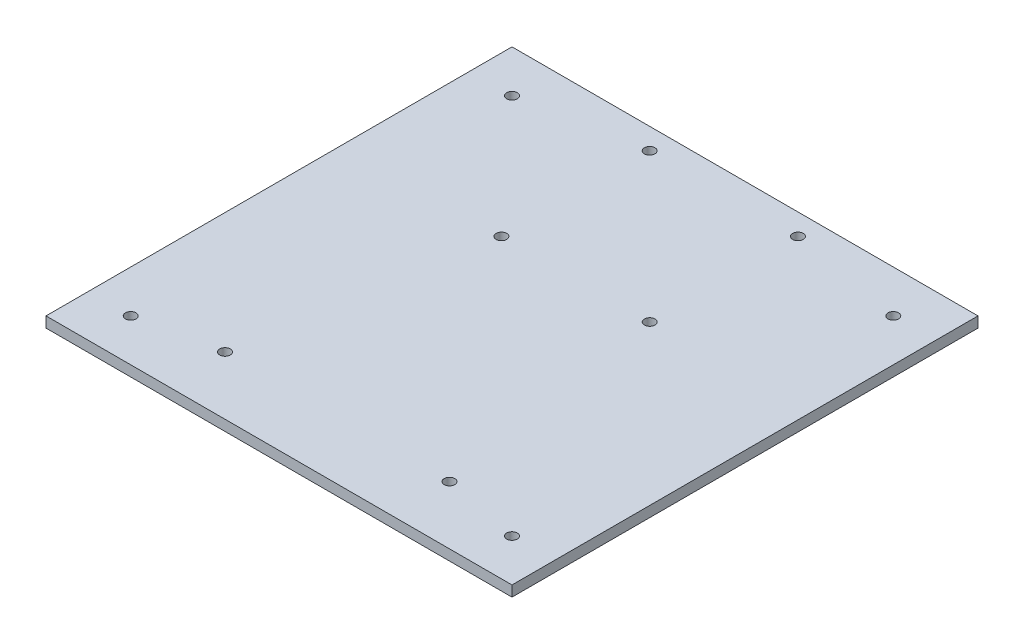
ISO-10303-21;
HEADER;
FILE_DESCRIPTION(('STEP AP214'),'2;1');
FILE_NAME('part.step','',(''),(''),'','','');
FILE_SCHEMA(('AUTOMOTIVE_DESIGN { 1 0 10303 214 1 1 1 1 }'));
ENDSEC;
DATA;
#1=APPLICATION_CONTEXT('core data for automotive mechanical design processes');
#2=APPLICATION_PROTOCOL_DEFINITION('international standard','automotive_design',2000,#1);
#3=PRODUCT_CONTEXT('',#1,'mechanical');
#4=PRODUCT('Part','Part','',(#3));
#5=PRODUCT_RELATED_PRODUCT_CATEGORY('part','',(#4));
#6=PRODUCT_DEFINITION_FORMATION('','',#4);
#7=PRODUCT_DEFINITION_CONTEXT('part definition',#1,'design');
#8=PRODUCT_DEFINITION('design','',#6,#7);
#9=PRODUCT_DEFINITION_SHAPE('','',#8);
#10=(LENGTH_UNIT() NAMED_UNIT(*) SI_UNIT(.MILLI.,.METRE.));
#11=(NAMED_UNIT(*) PLANE_ANGLE_UNIT() SI_UNIT($,.RADIAN.));
#12=(NAMED_UNIT(*) SI_UNIT($,.STERADIAN.) SOLID_ANGLE_UNIT());
#13=UNCERTAINTY_MEASURE_WITH_UNIT(LENGTH_MEASURE(1.E-05),#10,'distance_accuracy_value','');
#14=(GEOMETRIC_REPRESENTATION_CONTEXT(3) GLOBAL_UNCERTAINTY_ASSIGNED_CONTEXT((#13)) GLOBAL_UNIT_ASSIGNED_CONTEXT((#10,
#11,#12)) REPRESENTATION_CONTEXT('',''));
#15=CARTESIAN_POINT('',(0.,0.,0.));
#16=DIRECTION('',(0.,0.,1.));
#17=DIRECTION('',(1.,0.,0.));
#18=AXIS2_PLACEMENT_3D('',#15,#16,#17);
#19=CARTESIAN_POINT('',(-110.,5.,110.));
#20=DIRECTION('',(1.,0.,0.));
#21=DIRECTION('',(0.,0.,-1.));
#22=AXIS2_PLACEMENT_3D('',#19,#20,#21);
#23=PLANE('',#22);
#24=DIRECTION('',(0.,0.,1.));
#25=VECTOR('',#24,1.);
#26=CARTESIAN_POINT('',(-110.,0.,110.));
#27=LINE('',#26,#25);
#28=CARTESIAN_POINT('',(-110.,0.,-110.));
#29=VERTEX_POINT('',#28);
#30=CARTESIAN_POINT('',(-110.,0.,110.));
#31=VERTEX_POINT('',#30);
#32=EDGE_CURVE('E114',#29,#31,#27,.T.);
#33=ORIENTED_EDGE('',*,*,#32,.T.);
#34=DIRECTION('',(0.,-1.,0.));
#35=VECTOR('',#34,1.);
#36=CARTESIAN_POINT('',(-110.,5.,110.));
#37=LINE('',#36,#35);
#38=CARTESIAN_POINT('',(-110.,5.,110.));
#39=VERTEX_POINT('',#38);
#40=EDGE_CURVE('E11',#39,#31,#37,.T.);
#41=ORIENTED_EDGE('',*,*,#40,.F.);
#42=DIRECTION('',(0.,0.,1.));
#43=VECTOR('',#42,1.);
#44=CARTESIAN_POINT('',(-110.,5.,110.));
#45=LINE('',#44,#43);
#46=CARTESIAN_POINT('',(-110.,5.,-110.));
#47=VERTEX_POINT('',#46);
#48=EDGE_CURVE('E97',#47,#39,#45,.T.);
#49=ORIENTED_EDGE('',*,*,#48,.F.);
#50=DIRECTION('',(0.,-1.,0.));
#51=VECTOR('',#50,1.);
#52=CARTESIAN_POINT('',(-110.,5.,-110.));
#53=LINE('',#52,#51);
#54=EDGE_CURVE('E110',#47,#29,#53,.T.);
#55=ORIENTED_EDGE('',*,*,#54,.T.);
#56=EDGE_LOOP('',(#33,#41,#49,#55));
#57=FACE_BOUND('',#56,.T.);
#58=ADVANCED_FACE('F43',(#57),#23,.F.);
#59=CARTESIAN_POINT('',(110.,5.,110.));
#60=DIRECTION('',(0.,0.,-1.));
#61=DIRECTION('',(-1.,0.,0.));
#62=AXIS2_PLACEMENT_3D('',#59,#60,#61);
#63=PLANE('',#62);
#64=DIRECTION('',(1.,0.,0.));
#65=VECTOR('',#64,1.);
#66=CARTESIAN_POINT('',(110.,0.,110.));
#67=LINE('',#66,#65);
#68=CARTESIAN_POINT('',(110.,0.,110.));
#69=VERTEX_POINT('',#68);
#70=EDGE_CURVE('E102',#31,#69,#67,.T.);
#71=ORIENTED_EDGE('',*,*,#70,.T.);
#72=DIRECTION('',(0.,-1.,0.));
#73=VECTOR('',#72,1.);
#74=CARTESIAN_POINT('',(110.,5.,110.));
#75=LINE('',#74,#73);
#76=CARTESIAN_POINT('',(110.,5.,110.));
#77=VERTEX_POINT('',#76);
#78=EDGE_CURVE('E53',#77,#69,#75,.T.);
#79=ORIENTED_EDGE('',*,*,#78,.F.);
#80=DIRECTION('',(1.,0.,0.));
#81=VECTOR('',#80,1.);
#82=CARTESIAN_POINT('',(110.,5.,110.));
#83=LINE('',#82,#81);
#84=EDGE_CURVE('E92',#39,#77,#83,.T.);
#85=ORIENTED_EDGE('',*,*,#84,.F.);
#86=ORIENTED_EDGE('',*,*,#40,.T.);
#87=EDGE_LOOP('',(#71,#79,#85,#86));
#88=FACE_BOUND('',#87,.T.);
#89=ADVANCED_FACE('F101',(#88),#63,.F.);
#90=CARTESIAN_POINT('',(110.,5.,110.));
#91=DIRECTION('',(-1.,0.,0.));
#92=DIRECTION('',(0.,0.,1.));
#93=AXIS2_PLACEMENT_3D('',#90,#91,#92);
#94=PLANE('',#93);
#95=DIRECTION('',(0.,0.,-1.));
#96=VECTOR('',#95,1.);
#97=CARTESIAN_POINT('',(110.,0.,110.));
#98=LINE('',#97,#96);
#99=CARTESIAN_POINT('',(110.,0.,-110.));
#100=VERTEX_POINT('',#99);
#101=EDGE_CURVE('E79',#69,#100,#98,.T.);
#102=ORIENTED_EDGE('',*,*,#101,.T.);
#103=DIRECTION('',(0.,-1.,0.));
#104=VECTOR('',#103,1.);
#105=CARTESIAN_POINT('',(110.,5.,-110.));
#106=LINE('',#105,#104);
#107=CARTESIAN_POINT('',(110.,5.,-110.));
#108=VERTEX_POINT('',#107);
#109=EDGE_CURVE('E104',#108,#100,#106,.T.);
#110=ORIENTED_EDGE('',*,*,#109,.F.);
#111=DIRECTION('',(0.,0.,-1.));
#112=VECTOR('',#111,1.);
#113=CARTESIAN_POINT('',(110.,5.,110.));
#114=LINE('',#113,#112);
#115=EDGE_CURVE('E95',#77,#108,#114,.T.);
#116=ORIENTED_EDGE('',*,*,#115,.F.);
#117=ORIENTED_EDGE('',*,*,#78,.T.);
#118=EDGE_LOOP('',(#102,#110,#116,#117));
#119=FACE_BOUND('',#118,.T.);
#120=ADVANCED_FACE('F106',(#119),#94,.F.);
#121=CARTESIAN_POINT('',(110.,5.,-110.));
#122=DIRECTION('',(0.,0.,1.));
#123=DIRECTION('',(1.,0.,0.));
#124=AXIS2_PLACEMENT_3D('',#121,#122,#123);
#125=PLANE('',#124);
#126=DIRECTION('',(-1.,0.,0.));
#127=VECTOR('',#126,1.);
#128=CARTESIAN_POINT('',(110.,0.,-110.));
#129=LINE('',#128,#127);
#130=EDGE_CURVE('E85',#100,#29,#129,.T.);
#131=ORIENTED_EDGE('',*,*,#130,.T.);
#132=ORIENTED_EDGE('',*,*,#54,.F.);
#133=DIRECTION('',(-1.,0.,0.));
#134=VECTOR('',#133,1.);
#135=CARTESIAN_POINT('',(110.,5.,-110.));
#136=LINE('',#135,#134);
#137=EDGE_CURVE('E62',#108,#47,#136,.T.);
#138=ORIENTED_EDGE('',*,*,#137,.F.);
#139=ORIENTED_EDGE('',*,*,#109,.T.);
#140=EDGE_LOOP('',(#131,#132,#138,#139));
#141=FACE_BOUND('',#140,.T.);
#142=ADVANCED_FACE('F221',(#141),#125,.F.);
#143=CARTESIAN_POINT('',(0.,5.,0.));
#144=DIRECTION('',(0.,1.,0.));
#145=DIRECTION('',(0.,0.,1.));
#146=AXIS2_PLACEMENT_3D('',#143,#144,#145);
#147=PLANE('',#146);
#148=CARTESIAN_POINT('',(53.,5.,82.5));
#149=DIRECTION('',(0.,1.,0.));
#150=DIRECTION('',(0.,0.,1.));
#151=AXIS2_PLACEMENT_3D('',#148,#149,#150);
#152=CIRCLE('',#151,2.5);
#153=CARTESIAN_POINT('',(53.,5.,85.));
#154=VERTEX_POINT('',#153);
#155=EDGE_CURVE('E195',#154,#154,#152,.T.);
#156=ORIENTED_EDGE('',*,*,#155,.F.);
#157=EDGE_LOOP('',(#156));
#158=FACE_BOUND('',#157,.T.);
#159=CARTESIAN_POINT('',(35.,5.,-100.));
#160=DIRECTION('',(0.,1.,0.));
#161=DIRECTION('',(0.,0.,1.));
#162=AXIS2_PLACEMENT_3D('',#159,#160,#161);
#163=CIRCLE('',#162,2.5);
#164=CARTESIAN_POINT('',(35.,5.,-97.5));
#165=VERTEX_POINT('',#164);
#166=EDGE_CURVE('E194',#165,#165,#163,.T.);
#167=ORIENTED_EDGE('',*,*,#166,.F.);
#168=EDGE_LOOP('',(#167));
#169=FACE_BOUND('',#168,.T.);
#170=CARTESIAN_POINT('',(-35.,5.,-30.));
#171=DIRECTION('',(0.,1.,0.));
#172=DIRECTION('',(0.,0.,1.));
#173=AXIS2_PLACEMENT_3D('',#170,#171,#172);
#174=CIRCLE('',#173,2.5);
#175=CARTESIAN_POINT('',(-35.,5.,-27.5));
#176=VERTEX_POINT('',#175);
#177=EDGE_CURVE('E200',#176,#176,#174,.T.);
#178=ORIENTED_EDGE('',*,*,#177,.F.);
#179=EDGE_LOOP('',(#178));
#180=FACE_BOUND('',#179,.T.);
#181=CARTESIAN_POINT('',(35.,5.,-30.));
#182=DIRECTION('',(0.,1.,0.));
#183=DIRECTION('',(0.,0.,1.));
#184=AXIS2_PLACEMENT_3D('',#181,#182,#183);
#185=CIRCLE('',#184,2.5);
#186=CARTESIAN_POINT('',(35.,5.,-27.5));
#187=VERTEX_POINT('',#186);
#188=EDGE_CURVE('E204',#187,#187,#185,.T.);
#189=ORIENTED_EDGE('',*,*,#188,.F.);
#190=EDGE_LOOP('',(#189));
#191=FACE_BOUND('',#190,.T.);
#192=CARTESIAN_POINT('',(-53.,5.,82.5));
#193=DIRECTION('',(0.,1.,0.));
#194=DIRECTION('',(0.,0.,1.));
#195=AXIS2_PLACEMENT_3D('',#192,#193,#194);
#196=CIRCLE('',#195,2.5);
#197=CARTESIAN_POINT('',(-53.,5.,85.));
#198=VERTEX_POINT('',#197);
#199=EDGE_CURVE('E199',#198,#198,#196,.T.);
#200=ORIENTED_EDGE('',*,*,#199,.F.);
#201=EDGE_LOOP('',(#200));
#202=FACE_BOUND('',#201,.T.);
#203=CARTESIAN_POINT('',(-35.,5.,-100.));
#204=DIRECTION('',(0.,1.,0.));
#205=DIRECTION('',(0.,0.,1.));
#206=AXIS2_PLACEMENT_3D('',#203,#204,#205);
#207=CIRCLE('',#206,2.5);
#208=CARTESIAN_POINT('',(-35.,5.,-97.5));
#209=VERTEX_POINT('',#208);
#210=EDGE_CURVE('E134',#209,#209,#207,.T.);
#211=ORIENTED_EDGE('',*,*,#210,.F.);
#212=EDGE_LOOP('',(#211));
#213=FACE_BOUND('',#212,.T.);
#214=CARTESIAN_POINT('',(-90.,5.,90.));
#215=DIRECTION('',(0.,1.,0.));
#216=DIRECTION('',(0.,0.,-1.));
#217=AXIS2_PLACEMENT_3D('',#214,#215,#216);
#218=CIRCLE('',#217,2.50000000000001);
#219=CARTESIAN_POINT('',(-90.,5.,87.5));
#220=VERTEX_POINT('',#219);
#221=EDGE_CURVE('E152',#220,#220,#218,.T.);
#222=ORIENTED_EDGE('',*,*,#221,.F.);
#223=EDGE_LOOP('',(#222));
#224=FACE_BOUND('',#223,.T.);
#225=CARTESIAN_POINT('',(90.,5.,90.));
#226=DIRECTION('',(0.,1.,0.));
#227=DIRECTION('',(0.,0.,1.));
#228=AXIS2_PLACEMENT_3D('',#225,#226,#227);
#229=CIRCLE('',#228,2.50000000000001);
#230=CARTESIAN_POINT('',(90.,5.,92.5));
#231=VERTEX_POINT('',#230);
#232=EDGE_CURVE('E163',#231,#231,#229,.T.);
#233=ORIENTED_EDGE('',*,*,#232,.F.);
#234=EDGE_LOOP('',(#233));
#235=FACE_BOUND('',#234,.T.);
#236=CARTESIAN_POINT('',(90.,5.,-90.));
#237=DIRECTION('',(0.,1.,0.));
#238=DIRECTION('',(0.,0.,-1.));
#239=AXIS2_PLACEMENT_3D('',#236,#237,#238);
#240=CIRCLE('',#239,2.50000000000001);
#241=CARTESIAN_POINT('',(90.,5.,-92.5));
#242=VERTEX_POINT('',#241);
#243=EDGE_CURVE('E178',#242,#242,#240,.T.);
#244=ORIENTED_EDGE('',*,*,#243,.F.);
#245=EDGE_LOOP('',(#244));
#246=FACE_BOUND('',#245,.T.);
#247=CARTESIAN_POINT('',(-90.,5.,-90.));
#248=DIRECTION('',(0.,1.,0.));
#249=DIRECTION('',(0.,0.,1.));
#250=AXIS2_PLACEMENT_3D('',#247,#248,#249);
#251=CIRCLE('',#250,2.50000000000001);
#252=CARTESIAN_POINT('',(-90.,5.,-87.5));
#253=VERTEX_POINT('',#252);
#254=EDGE_CURVE('E170',#253,#253,#251,.T.);
#255=ORIENTED_EDGE('',*,*,#254,.F.);
#256=EDGE_LOOP('',(#255));
#257=FACE_BOUND('',#256,.T.);
#258=ORIENTED_EDGE('',*,*,#48,.T.);
#259=ORIENTED_EDGE('',*,*,#84,.T.);
#260=ORIENTED_EDGE('',*,*,#115,.T.);
#261=ORIENTED_EDGE('',*,*,#137,.T.);
#262=EDGE_LOOP('',(#258,#259,#260,#261));
#263=FACE_BOUND('',#262,.T.);
#264=ADVANCED_FACE('F93',(#158,#169,#180,#191,#202,#213,#224,#235,#246,#257,#263),#147,.T.);
#265=CARTESIAN_POINT('',(0.,0.,0.));
#266=DIRECTION('',(0.,1.,0.));
#267=DIRECTION('',(0.,0.,1.));
#268=AXIS2_PLACEMENT_3D('',#265,#266,#267);
#269=PLANE('',#268);
#270=CARTESIAN_POINT('',(53.,0.,82.5));
#271=DIRECTION('',(0.,1.,0.));
#272=DIRECTION('',(0.,0.,1.));
#273=AXIS2_PLACEMENT_3D('',#270,#271,#272);
#274=CIRCLE('',#273,2.5);
#275=CARTESIAN_POINT('',(53.,0.,85.));
#276=VERTEX_POINT('',#275);
#277=EDGE_CURVE('E46',#276,#276,#274,.T.);
#278=ORIENTED_EDGE('',*,*,#277,.T.);
#279=EDGE_LOOP('',(#278));
#280=FACE_BOUND('',#279,.T.);
#281=CARTESIAN_POINT('',(35.,0.,-100.));
#282=DIRECTION('',(0.,1.,0.));
#283=DIRECTION('',(0.,0.,1.));
#284=AXIS2_PLACEMENT_3D('',#281,#282,#283);
#285=CIRCLE('',#284,2.5);
#286=CARTESIAN_POINT('',(35.,0.,-97.5));
#287=VERTEX_POINT('',#286);
#288=EDGE_CURVE('E145',#287,#287,#285,.T.);
#289=ORIENTED_EDGE('',*,*,#288,.T.);
#290=EDGE_LOOP('',(#289));
#291=FACE_BOUND('',#290,.T.);
#292=CARTESIAN_POINT('',(-35.,0.,-30.));
#293=DIRECTION('',(0.,1.,0.));
#294=DIRECTION('',(0.,0.,1.));
#295=AXIS2_PLACEMENT_3D('',#292,#293,#294);
#296=CIRCLE('',#295,2.5);
#297=CARTESIAN_POINT('',(-35.,0.,-27.5));
#298=VERTEX_POINT('',#297);
#299=EDGE_CURVE('E142',#298,#298,#296,.T.);
#300=ORIENTED_EDGE('',*,*,#299,.T.);
#301=EDGE_LOOP('',(#300));
#302=FACE_BOUND('',#301,.T.);
#303=CARTESIAN_POINT('',(35.,0.,-30.));
#304=DIRECTION('',(0.,1.,0.));
#305=DIRECTION('',(0.,0.,1.));
#306=AXIS2_PLACEMENT_3D('',#303,#304,#305);
#307=CIRCLE('',#306,2.5);
#308=CARTESIAN_POINT('',(35.,0.,-27.5));
#309=VERTEX_POINT('',#308);
#310=EDGE_CURVE('E138',#309,#309,#307,.T.);
#311=ORIENTED_EDGE('',*,*,#310,.T.);
#312=EDGE_LOOP('',(#311));
#313=FACE_BOUND('',#312,.T.);
#314=CARTESIAN_POINT('',(-53.,0.,82.5));
#315=DIRECTION('',(0.,1.,0.));
#316=DIRECTION('',(0.,0.,1.));
#317=AXIS2_PLACEMENT_3D('',#314,#315,#316);
#318=CIRCLE('',#317,2.5);
#319=CARTESIAN_POINT('',(-53.,0.,85.));
#320=VERTEX_POINT('',#319);
#321=EDGE_CURVE('E133',#320,#320,#318,.T.);
#322=ORIENTED_EDGE('',*,*,#321,.T.);
#323=EDGE_LOOP('',(#322));
#324=FACE_BOUND('',#323,.T.);
#325=CARTESIAN_POINT('',(-35.,0.,-100.));
#326=DIRECTION('',(0.,1.,0.));
#327=DIRECTION('',(0.,0.,1.));
#328=AXIS2_PLACEMENT_3D('',#325,#326,#327);
#329=CIRCLE('',#328,2.5);
#330=CARTESIAN_POINT('',(-35.,0.,-97.5));
#331=VERTEX_POINT('',#330);
#332=EDGE_CURVE('E129',#331,#331,#329,.T.);
#333=ORIENTED_EDGE('',*,*,#332,.T.);
#334=EDGE_LOOP('',(#333));
#335=FACE_BOUND('',#334,.T.);
#336=CARTESIAN_POINT('',(-90.,0.,90.));
#337=DIRECTION('',(0.,1.,0.));
#338=DIRECTION('',(0.,0.,-1.));
#339=AXIS2_PLACEMENT_3D('',#336,#337,#338);
#340=CIRCLE('',#339,2.50000000000001);
#341=CARTESIAN_POINT('',(-90.,0.,87.5));
#342=VERTEX_POINT('',#341);
#343=EDGE_CURVE('E157',#342,#342,#340,.T.);
#344=ORIENTED_EDGE('',*,*,#343,.T.);
#345=EDGE_LOOP('',(#344));
#346=FACE_BOUND('',#345,.T.);
#347=CARTESIAN_POINT('',(90.,0.,90.));
#348=DIRECTION('',(0.,1.,0.));
#349=DIRECTION('',(0.,0.,1.));
#350=AXIS2_PLACEMENT_3D('',#347,#348,#349);
#351=CIRCLE('',#350,2.50000000000001);
#352=CARTESIAN_POINT('',(90.,0.,92.5));
#353=VERTEX_POINT('',#352);
#354=EDGE_CURVE('E182',#353,#353,#351,.T.);
#355=ORIENTED_EDGE('',*,*,#354,.T.);
#356=EDGE_LOOP('',(#355));
#357=FACE_BOUND('',#356,.T.);
#358=CARTESIAN_POINT('',(90.,0.,-90.));
#359=DIRECTION('',(0.,1.,0.));
#360=DIRECTION('',(0.,0.,-1.));
#361=AXIS2_PLACEMENT_3D('',#358,#359,#360);
#362=CIRCLE('',#361,2.50000000000001);
#363=CARTESIAN_POINT('',(90.,0.,-92.5));
#364=VERTEX_POINT('',#363);
#365=EDGE_CURVE('E173',#364,#364,#362,.T.);
#366=ORIENTED_EDGE('',*,*,#365,.T.);
#367=EDGE_LOOP('',(#366));
#368=FACE_BOUND('',#367,.T.);
#369=CARTESIAN_POINT('',(-90.,0.,-90.));
#370=DIRECTION('',(0.,1.,0.));
#371=DIRECTION('',(0.,0.,1.));
#372=AXIS2_PLACEMENT_3D('',#369,#370,#371);
#373=CIRCLE('',#372,2.50000000000001);
#374=CARTESIAN_POINT('',(-90.,0.,-87.5));
#375=VERTEX_POINT('',#374);
#376=EDGE_CURVE('E118',#375,#375,#373,.T.);
#377=ORIENTED_EDGE('',*,*,#376,.T.);
#378=EDGE_LOOP('',(#377));
#379=FACE_BOUND('',#378,.T.);
#380=ORIENTED_EDGE('',*,*,#32,.F.);
#381=ORIENTED_EDGE('',*,*,#130,.F.);
#382=ORIENTED_EDGE('',*,*,#101,.F.);
#383=ORIENTED_EDGE('',*,*,#70,.F.);
#384=EDGE_LOOP('',(#380,#381,#382,#383));
#385=FACE_BOUND('',#384,.T.);
#386=ADVANCED_FACE('F220',(#280,#291,#302,#313,#324,#335,#346,#357,#368,#379,#385),#269,.F.);
#387=CARTESIAN_POINT('',(-90.,0.,-90.));
#388=DIRECTION('',(0.,1.,0.));
#389=DIRECTION('',(0.,0.,1.));
#390=AXIS2_PLACEMENT_3D('',#387,#388,#389);
#391=CYLINDRICAL_SURFACE('',#390,2.50000000000001);
#392=ORIENTED_EDGE('',*,*,#376,.F.);
#393=EDGE_LOOP('',(#392));
#394=FACE_BOUND('',#393,.T.);
#395=ORIENTED_EDGE('',*,*,#254,.T.);
#396=EDGE_LOOP('',(#395));
#397=FACE_BOUND('',#396,.T.);
#398=ADVANCED_FACE('F234',(#394,#397),#391,.F.);
#399=CARTESIAN_POINT('',(90.,0.,-90.));
#400=DIRECTION('',(0.,1.,0.));
#401=DIRECTION('',(0.,0.,1.));
#402=AXIS2_PLACEMENT_3D('',#399,#400,#401);
#403=CYLINDRICAL_SURFACE('',#402,2.50000000000001);
#404=ORIENTED_EDGE('',*,*,#365,.F.);
#405=EDGE_LOOP('',(#404));
#406=FACE_BOUND('',#405,.T.);
#407=ORIENTED_EDGE('',*,*,#243,.T.);
#408=EDGE_LOOP('',(#407));
#409=FACE_BOUND('',#408,.T.);
#410=ADVANCED_FACE('F236',(#406,#409),#403,.F.);
#411=CARTESIAN_POINT('',(90.,0.,90.));
#412=DIRECTION('',(0.,1.,0.));
#413=DIRECTION('',(0.,0.,1.));
#414=AXIS2_PLACEMENT_3D('',#411,#412,#413);
#415=CYLINDRICAL_SURFACE('',#414,2.50000000000001);
#416=ORIENTED_EDGE('',*,*,#354,.F.);
#417=EDGE_LOOP('',(#416));
#418=FACE_BOUND('',#417,.T.);
#419=ORIENTED_EDGE('',*,*,#232,.T.);
#420=EDGE_LOOP('',(#419));
#421=FACE_BOUND('',#420,.T.);
#422=ADVANCED_FACE('F243',(#418,#421),#415,.F.);
#423=CARTESIAN_POINT('',(-90.,0.,90.));
#424=DIRECTION('',(0.,1.,0.));
#425=DIRECTION('',(0.,0.,1.));
#426=AXIS2_PLACEMENT_3D('',#423,#424,#425);
#427=CYLINDRICAL_SURFACE('',#426,2.50000000000001);
#428=ORIENTED_EDGE('',*,*,#343,.F.);
#429=EDGE_LOOP('',(#428));
#430=FACE_BOUND('',#429,.T.);
#431=ORIENTED_EDGE('',*,*,#221,.T.);
#432=EDGE_LOOP('',(#431));
#433=FACE_BOUND('',#432,.T.);
#434=ADVANCED_FACE('F309',(#430,#433),#427,.F.);
#435=CARTESIAN_POINT('',(-35.,-5.,-100.));
#436=DIRECTION('',(0.,1.,0.));
#437=DIRECTION('',(0.,0.,1.));
#438=AXIS2_PLACEMENT_3D('',#435,#436,#437);
#439=CYLINDRICAL_SURFACE('',#438,2.5);
#440=ORIENTED_EDGE('',*,*,#210,.T.);
#441=EDGE_LOOP('',(#440));
#442=FACE_BOUND('',#441,.T.);
#443=ORIENTED_EDGE('',*,*,#332,.F.);
#444=EDGE_LOOP('',(#443));
#445=FACE_BOUND('',#444,.T.);
#446=ADVANCED_FACE('F317',(#442,#445),#439,.F.);
#447=CARTESIAN_POINT('',(-53.,-5.,82.5));
#448=DIRECTION('',(0.,1.,0.));
#449=DIRECTION('',(0.,0.,1.));
#450=AXIS2_PLACEMENT_3D('',#447,#448,#449);
#451=CYLINDRICAL_SURFACE('',#450,2.5);
#452=ORIENTED_EDGE('',*,*,#199,.T.);
#453=EDGE_LOOP('',(#452));
#454=FACE_BOUND('',#453,.T.);
#455=ORIENTED_EDGE('',*,*,#321,.F.);
#456=EDGE_LOOP('',(#455));
#457=FACE_BOUND('',#456,.T.);
#458=ADVANCED_FACE('F324',(#454,#457),#451,.F.);
#459=CARTESIAN_POINT('',(35.,-5.,-30.));
#460=DIRECTION('',(0.,1.,0.));
#461=DIRECTION('',(0.,0.,1.));
#462=AXIS2_PLACEMENT_3D('',#459,#460,#461);
#463=CYLINDRICAL_SURFACE('',#462,2.5);
#464=ORIENTED_EDGE('',*,*,#188,.T.);
#465=EDGE_LOOP('',(#464));
#466=FACE_BOUND('',#465,.T.);
#467=ORIENTED_EDGE('',*,*,#310,.F.);
#468=EDGE_LOOP('',(#467));
#469=FACE_BOUND('',#468,.T.);
#470=ADVANCED_FACE('F215',(#466,#469),#463,.F.);
#471=CARTESIAN_POINT('',(-35.,-5.,-30.));
#472=DIRECTION('',(0.,1.,0.));
#473=DIRECTION('',(0.,0.,1.));
#474=AXIS2_PLACEMENT_3D('',#471,#472,#473);
#475=CYLINDRICAL_SURFACE('',#474,2.5);
#476=ORIENTED_EDGE('',*,*,#177,.T.);
#477=EDGE_LOOP('',(#476));
#478=FACE_BOUND('',#477,.T.);
#479=ORIENTED_EDGE('',*,*,#299,.F.);
#480=EDGE_LOOP('',(#479));
#481=FACE_BOUND('',#480,.T.);
#482=ADVANCED_FACE('F341',(#478,#481),#475,.F.);
#483=CARTESIAN_POINT('',(35.,-5.,-100.));
#484=DIRECTION('',(0.,1.,0.));
#485=DIRECTION('',(0.,0.,1.));
#486=AXIS2_PLACEMENT_3D('',#483,#484,#485);
#487=CYLINDRICAL_SURFACE('',#486,2.5);
#488=ORIENTED_EDGE('',*,*,#166,.T.);
#489=EDGE_LOOP('',(#488));
#490=FACE_BOUND('',#489,.T.);
#491=ORIENTED_EDGE('',*,*,#288,.F.);
#492=EDGE_LOOP('',(#491));
#493=FACE_BOUND('',#492,.T.);
#494=ADVANCED_FACE('F349',(#490,#493),#487,.F.);
#495=CARTESIAN_POINT('',(53.,-5.,82.5));
#496=DIRECTION('',(0.,1.,0.));
#497=DIRECTION('',(0.,0.,1.));
#498=AXIS2_PLACEMENT_3D('',#495,#496,#497);
#499=CYLINDRICAL_SURFACE('',#498,2.5);
#500=ORIENTED_EDGE('',*,*,#155,.T.);
#501=EDGE_LOOP('',(#500));
#502=FACE_BOUND('',#501,.T.);
#503=ORIENTED_EDGE('',*,*,#277,.F.);
#504=EDGE_LOOP('',(#503));
#505=FACE_BOUND('',#504,.T.);
#506=ADVANCED_FACE('F358',(#502,#505),#499,.F.);
#507=CLOSED_SHELL('',(#58,#89,#120,#142,#264,#386,#398,#410,#422,#434,#446,#458,#470,#482,#494,#506));
#508=MANIFOLD_SOLID_BREP('B2',#507);
#509=ADVANCED_BREP_SHAPE_REPRESENTATION('',(#18,#508),#14);
#510=SHAPE_DEFINITION_REPRESENTATION(#9,#509);
ENDSEC;
END-ISO-10303-21;
